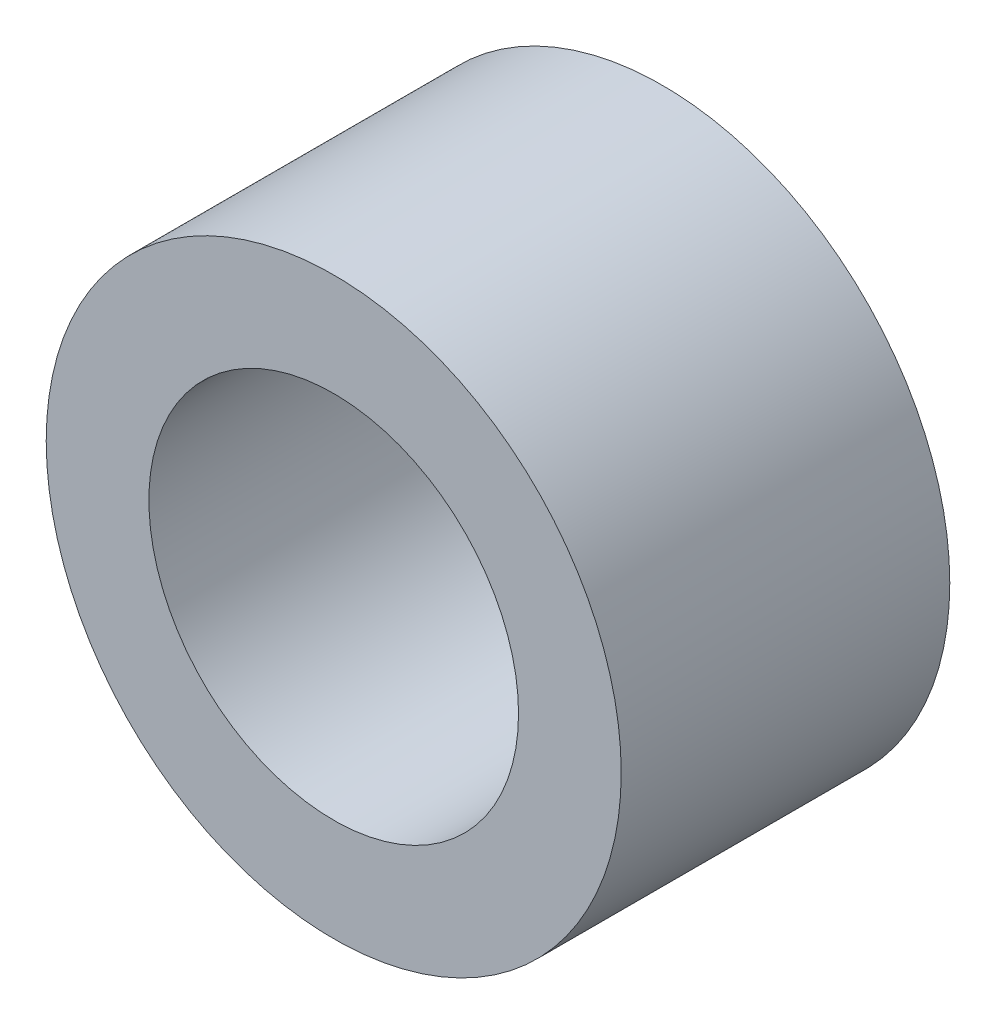
ISO-10303-21;
HEADER;
FILE_DESCRIPTION(('STEP AP214'),'2;1');
FILE_NAME('part.step','',(''),(''),'','','');
FILE_SCHEMA(('AUTOMOTIVE_DESIGN { 1 0 10303 214 1 1 1 1 }'));
ENDSEC;
DATA;
#1=APPLICATION_CONTEXT('core data for automotive mechanical design processes');
#2=APPLICATION_PROTOCOL_DEFINITION('international standard','automotive_design',2000,#1);
#3=PRODUCT_CONTEXT('',#1,'mechanical');
#4=PRODUCT('Part','Part','',(#3));
#5=PRODUCT_RELATED_PRODUCT_CATEGORY('part','',(#4));
#6=PRODUCT_DEFINITION_FORMATION('','',#4);
#7=PRODUCT_DEFINITION_CONTEXT('part definition',#1,'design');
#8=PRODUCT_DEFINITION('design','',#6,#7);
#9=PRODUCT_DEFINITION_SHAPE('','',#8);
#10=(LENGTH_UNIT() NAMED_UNIT(*) SI_UNIT(.MILLI.,.METRE.));
#11=(NAMED_UNIT(*) PLANE_ANGLE_UNIT() SI_UNIT($,.RADIAN.));
#12=(NAMED_UNIT(*) SI_UNIT($,.STERADIAN.) SOLID_ANGLE_UNIT());
#13=UNCERTAINTY_MEASURE_WITH_UNIT(LENGTH_MEASURE(1.E-05),#10,'distance_accuracy_value','');
#14=(GEOMETRIC_REPRESENTATION_CONTEXT(3) GLOBAL_UNCERTAINTY_ASSIGNED_CONTEXT((#13)) GLOBAL_UNIT_ASSIGNED_CONTEXT((#10,
#11,#12)) REPRESENTATION_CONTEXT('',''));
#15=CARTESIAN_POINT('',(0.,0.,0.));
#16=DIRECTION('',(0.,0.,1.));
#17=DIRECTION('',(1.,0.,0.));
#18=AXIS2_PLACEMENT_3D('',#15,#16,#17);
#19=CARTESIAN_POINT('',(0.,0.,-4.));
#20=DIRECTION('',(0.,0.,1.));
#21=DIRECTION('',(1.,0.,0.));
#22=AXIS2_PLACEMENT_3D('',#19,#20,#21);
#23=CYLINDRICAL_SURFACE('',#22,3.5);
#24=CARTESIAN_POINT('',(0.,0.,-4.));
#25=DIRECTION('',(0.,0.,1.));
#26=DIRECTION('',(1.,0.,0.));
#27=AXIS2_PLACEMENT_3D('',#24,#25,#26);
#28=CIRCLE('',#27,3.5);
#29=CARTESIAN_POINT('',(3.5,0.,-4.));
#30=VERTEX_POINT('',#29);
#31=EDGE_CURVE('E10',#30,#30,#28,.T.);
#32=ORIENTED_EDGE('',*,*,#31,.T.);
#33=EDGE_LOOP('',(#32));
#34=FACE_BOUND('',#33,.T.);
#35=CARTESIAN_POINT('',(0.,0.,0.));
#36=DIRECTION('',(0.,0.,1.));
#37=DIRECTION('',(1.,0.,0.));
#38=AXIS2_PLACEMENT_3D('',#35,#36,#37);
#39=CIRCLE('',#38,3.5);
#40=CARTESIAN_POINT('',(3.5,0.,0.));
#41=VERTEX_POINT('',#40);
#42=EDGE_CURVE('E38',#41,#41,#39,.T.);
#43=ORIENTED_EDGE('',*,*,#42,.F.);
#44=EDGE_LOOP('',(#43));
#45=FACE_BOUND('',#44,.T.);
#46=ADVANCED_FACE('F35',(#34,#45),#23,.T.);
#47=CARTESIAN_POINT('',(0.,0.,-4.));
#48=DIRECTION('',(0.,0.,1.));
#49=DIRECTION('',(1.,0.,0.));
#50=AXIS2_PLACEMENT_3D('',#47,#48,#49);
#51=PLANE('',#50);
#52=CARTESIAN_POINT('',(0.,0.,-4.));
#53=DIRECTION('',(0.,0.,1.));
#54=DIRECTION('',(1.,0.,0.));
#55=AXIS2_PLACEMENT_3D('',#52,#53,#54);
#56=CIRCLE('',#55,2.25);
#57=CARTESIAN_POINT('',(2.25,0.,-4.));
#58=VERTEX_POINT('',#57);
#59=EDGE_CURVE('E45',#58,#58,#56,.T.);
#60=ORIENTED_EDGE('',*,*,#59,.T.);
#61=EDGE_LOOP('',(#60));
#62=FACE_BOUND('',#61,.T.);
#63=ORIENTED_EDGE('',*,*,#31,.F.);
#64=EDGE_LOOP('',(#63));
#65=FACE_BOUND('',#64,.T.);
#66=ADVANCED_FACE('F53',(#62,#65),#51,.F.);
#67=CARTESIAN_POINT('',(0.,0.,0.));
#68=DIRECTION('',(0.,0.,1.));
#69=DIRECTION('',(1.,0.,0.));
#70=AXIS2_PLACEMENT_3D('',#67,#68,#69);
#71=PLANE('',#70);
#72=CARTESIAN_POINT('',(0.,0.,0.));
#73=DIRECTION('',(0.,0.,1.));
#74=DIRECTION('',(1.,0.,0.));
#75=AXIS2_PLACEMENT_3D('',#72,#73,#74);
#76=CIRCLE('',#75,2.25);
#77=CARTESIAN_POINT('',(2.25,0.,0.));
#78=VERTEX_POINT('',#77);
#79=EDGE_CURVE('E47',#78,#78,#76,.T.);
#80=ORIENTED_EDGE('',*,*,#79,.F.);
#81=EDGE_LOOP('',(#80));
#82=FACE_BOUND('',#81,.T.);
#83=ORIENTED_EDGE('',*,*,#42,.T.);
#84=EDGE_LOOP('',(#83));
#85=FACE_BOUND('',#84,.T.);
#86=ADVANCED_FACE('F59',(#82,#85),#71,.T.);
#87=CARTESIAN_POINT('',(0.,0.,-4.));
#88=DIRECTION('',(0.,0.,1.));
#89=DIRECTION('',(1.,0.,0.));
#90=AXIS2_PLACEMENT_3D('',#87,#88,#89);
#91=CYLINDRICAL_SURFACE('',#90,2.25);
#92=ORIENTED_EDGE('',*,*,#59,.F.);
#93=EDGE_LOOP('',(#92));
#94=FACE_BOUND('',#93,.T.);
#95=ORIENTED_EDGE('',*,*,#79,.T.);
#96=EDGE_LOOP('',(#95));
#97=FACE_BOUND('',#96,.T.);
#98=ADVANCED_FACE('F56',(#94,#97),#91,.F.);
#99=CLOSED_SHELL('',(#46,#66,#86,#98));
#100=MANIFOLD_SOLID_BREP('B2',#99);
#101=ADVANCED_BREP_SHAPE_REPRESENTATION('',(#18,#100),#14);
#102=SHAPE_DEFINITION_REPRESENTATION(#9,#101);
ENDSEC;
END-ISO-10303-21;
